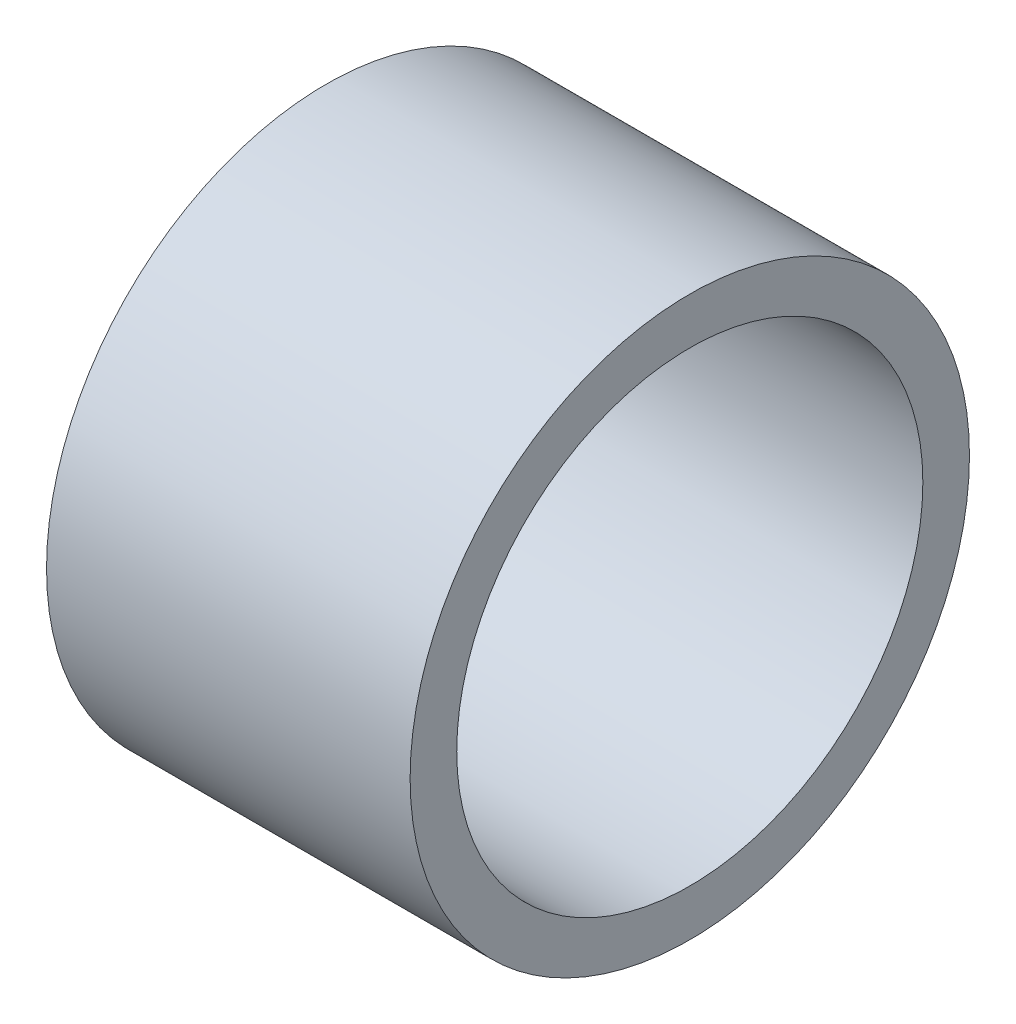
ISO-10303-21;
HEADER;
FILE_DESCRIPTION(('STEP AP214'),'2;1');
FILE_NAME('part.step','',(''),(''),'','','');
FILE_SCHEMA(('AUTOMOTIVE_DESIGN { 1 0 10303 214 1 1 1 1 }'));
ENDSEC;
DATA;
#1=APPLICATION_CONTEXT('core data for automotive mechanical design processes');
#2=APPLICATION_PROTOCOL_DEFINITION('international standard','automotive_design',2000,#1);
#3=PRODUCT_CONTEXT('',#1,'mechanical');
#4=PRODUCT('Part','Part','',(#3));
#5=PRODUCT_RELATED_PRODUCT_CATEGORY('part','',(#4));
#6=PRODUCT_DEFINITION_FORMATION('','',#4);
#7=PRODUCT_DEFINITION_CONTEXT('part definition',#1,'design');
#8=PRODUCT_DEFINITION('design','',#6,#7);
#9=PRODUCT_DEFINITION_SHAPE('','',#8);
#10=(LENGTH_UNIT() NAMED_UNIT(*) SI_UNIT(.MILLI.,.METRE.));
#11=(NAMED_UNIT(*) PLANE_ANGLE_UNIT() SI_UNIT($,.RADIAN.));
#12=(NAMED_UNIT(*) SI_UNIT($,.STERADIAN.) SOLID_ANGLE_UNIT());
#13=UNCERTAINTY_MEASURE_WITH_UNIT(LENGTH_MEASURE(1.E-05),#10,'distance_accuracy_value','');
#14=(GEOMETRIC_REPRESENTATION_CONTEXT(3) GLOBAL_UNCERTAINTY_ASSIGNED_CONTEXT((#13)) GLOBAL_UNIT_ASSIGNED_CONTEXT((#10,
#11,#12)) REPRESENTATION_CONTEXT('',''));
#15=CARTESIAN_POINT('',(0.,0.,0.));
#16=DIRECTION('',(0.,0.,1.));
#17=DIRECTION('',(1.,0.,0.));
#18=AXIS2_PLACEMENT_3D('',#15,#16,#17);
#19=CARTESIAN_POINT('',(7.8,0.,0.));
#20=DIRECTION('',(1.,0.,0.));
#21=DIRECTION('',(0.,0.,-1.));
#22=AXIS2_PLACEMENT_3D('',#19,#20,#21);
#23=PLANE('',#22);
#24=CARTESIAN_POINT('',(7.8,0.,0.));
#25=DIRECTION('',(1.,0.,0.));
#26=DIRECTION('',(0.,0.,-1.));
#27=AXIS2_PLACEMENT_3D('',#24,#25,#26);
#28=CIRCLE('',#27,6.);
#29=CARTESIAN_POINT('',(7.8,0.,-6.));
#30=VERTEX_POINT('',#29);
#31=EDGE_CURVE('E10',#30,#30,#28,.T.);
#32=ORIENTED_EDGE('',*,*,#31,.T.);
#33=EDGE_LOOP('',(#32));
#34=FACE_BOUND('',#33,.T.);
#35=CARTESIAN_POINT('',(7.8,0.,0.));
#36=DIRECTION('',(1.,0.,0.));
#37=DIRECTION('',(0.,0.,-1.));
#38=AXIS2_PLACEMENT_3D('',#35,#36,#37);
#39=CIRCLE('',#38,5.);
#40=CARTESIAN_POINT('',(7.8,0.,-5.));
#41=VERTEX_POINT('',#40);
#42=EDGE_CURVE('E54',#41,#41,#39,.T.);
#43=ORIENTED_EDGE('',*,*,#42,.F.);
#44=EDGE_LOOP('',(#43));
#45=FACE_BOUND('',#44,.T.);
#46=ADVANCED_FACE('F41',(#34,#45),#23,.T.);
#47=CARTESIAN_POINT('',(0.,0.,0.));
#48=DIRECTION('',(1.,0.,0.));
#49=DIRECTION('',(0.,0.,-1.));
#50=AXIS2_PLACEMENT_3D('',#47,#48,#49);
#51=PLANE('',#50);
#52=CARTESIAN_POINT('',(0.,0.,0.));
#53=DIRECTION('',(1.,0.,0.));
#54=DIRECTION('',(0.,0.,-1.));
#55=AXIS2_PLACEMENT_3D('',#52,#53,#54);
#56=CIRCLE('',#55,6.);
#57=CARTESIAN_POINT('',(0.,0.,-6.));
#58=VERTEX_POINT('',#57);
#59=EDGE_CURVE('E45',#58,#58,#56,.T.);
#60=ORIENTED_EDGE('',*,*,#59,.F.);
#61=EDGE_LOOP('',(#60));
#62=FACE_BOUND('',#61,.T.);
#63=CARTESIAN_POINT('',(0.,0.,0.));
#64=DIRECTION('',(1.,0.,0.));
#65=DIRECTION('',(0.,0.,-1.));
#66=AXIS2_PLACEMENT_3D('',#63,#64,#65);
#67=CIRCLE('',#66,5.);
#68=CARTESIAN_POINT('',(0.,0.,-5.));
#69=VERTEX_POINT('',#68);
#70=EDGE_CURVE('E56',#69,#69,#67,.T.);
#71=ORIENTED_EDGE('',*,*,#70,.T.);
#72=EDGE_LOOP('',(#71));
#73=FACE_BOUND('',#72,.T.);
#74=ADVANCED_FACE('F68',(#62,#73),#51,.F.);
#75=CARTESIAN_POINT('',(7.8,0.,0.));
#76=DIRECTION('',(-1.,0.,0.));
#77=DIRECTION('',(0.,0.,1.));
#78=AXIS2_PLACEMENT_3D('',#75,#76,#77);
#79=CYLINDRICAL_SURFACE('',#78,6.);
#80=ORIENTED_EDGE('',*,*,#31,.F.);
#81=EDGE_LOOP('',(#80));
#82=FACE_BOUND('',#81,.T.);
#83=ORIENTED_EDGE('',*,*,#59,.T.);
#84=EDGE_LOOP('',(#83));
#85=FACE_BOUND('',#84,.T.);
#86=ADVANCED_FACE('F43',(#82,#85),#79,.T.);
#87=CARTESIAN_POINT('',(7.8,0.,0.));
#88=DIRECTION('',(-1.,0.,0.));
#89=DIRECTION('',(0.,0.,1.));
#90=AXIS2_PLACEMENT_3D('',#87,#88,#89);
#91=CYLINDRICAL_SURFACE('',#90,5.);
#92=ORIENTED_EDGE('',*,*,#42,.T.);
#93=EDGE_LOOP('',(#92));
#94=FACE_BOUND('',#93,.T.);
#95=ORIENTED_EDGE('',*,*,#70,.F.);
#96=EDGE_LOOP('',(#95));
#97=FACE_BOUND('',#96,.T.);
#98=ADVANCED_FACE('F64',(#94,#97),#91,.F.);
#99=CLOSED_SHELL('',(#46,#74,#86,#98));
#100=MANIFOLD_SOLID_BREP('B2',#99);
#101=ADVANCED_BREP_SHAPE_REPRESENTATION('',(#18,#100),#14);
#102=SHAPE_DEFINITION_REPRESENTATION(#9,#101);
ENDSEC;
END-ISO-10303-21;
